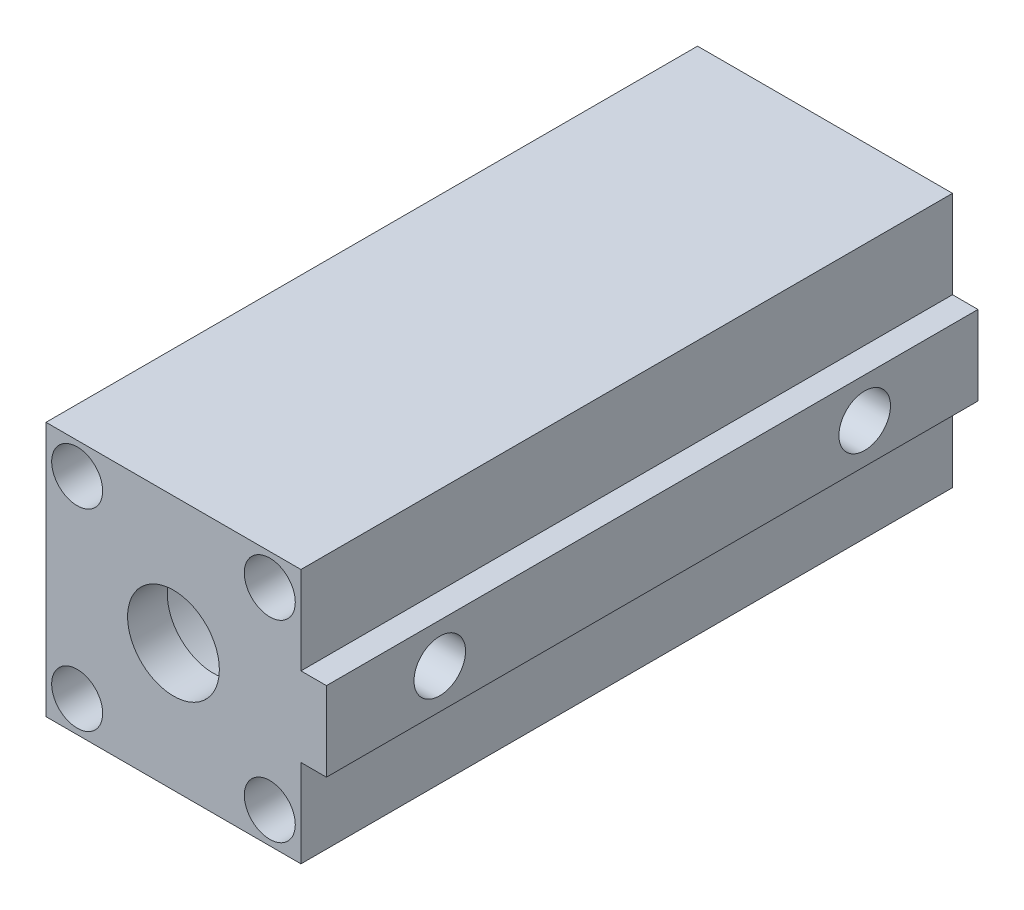
ISO-10303-21;
HEADER;
FILE_DESCRIPTION(('STEP AP214'),'2;1');
FILE_NAME('part.step','',(''),(''),'','','');
FILE_SCHEMA(('AUTOMOTIVE_DESIGN { 1 0 10303 214 1 1 1 1 }'));
ENDSEC;
DATA;
#1=APPLICATION_CONTEXT('core data for automotive mechanical design processes');
#2=APPLICATION_PROTOCOL_DEFINITION('international standard','automotive_design',2000,#1);
#3=PRODUCT_CONTEXT('',#1,'mechanical');
#4=PRODUCT('Part','Part','',(#3));
#5=PRODUCT_RELATED_PRODUCT_CATEGORY('part','',(#4));
#6=PRODUCT_DEFINITION_FORMATION('','',#4);
#7=PRODUCT_DEFINITION_CONTEXT('part definition',#1,'design');
#8=PRODUCT_DEFINITION('design','',#6,#7);
#9=PRODUCT_DEFINITION_SHAPE('','',#8);
#10=(LENGTH_UNIT() NAMED_UNIT(*) SI_UNIT(.MILLI.,.METRE.));
#11=(NAMED_UNIT(*) PLANE_ANGLE_UNIT() SI_UNIT($,.RADIAN.));
#12=(NAMED_UNIT(*) SI_UNIT($,.STERADIAN.) SOLID_ANGLE_UNIT());
#13=UNCERTAINTY_MEASURE_WITH_UNIT(LENGTH_MEASURE(1.E-05),#10,'distance_accuracy_value','');
#14=(GEOMETRIC_REPRESENTATION_CONTEXT(3) GLOBAL_UNCERTAINTY_ASSIGNED_CONTEXT((#13)) GLOBAL_UNIT_ASSIGNED_CONTEXT((#10,
#11,#12)) REPRESENTATION_CONTEXT('',''));
#15=CARTESIAN_POINT('',(0.,0.,0.));
#16=DIRECTION('',(0.,0.,1.));
#17=DIRECTION('',(1.,0.,0.));
#18=AXIS2_PLACEMENT_3D('',#15,#16,#17);
#19=CARTESIAN_POINT('',(22.5,-22.5,115.));
#20=DIRECTION('',(-1.,0.,0.));
#21=DIRECTION('',(0.,0.,1.));
#22=AXIS2_PLACEMENT_3D('',#19,#20,#21);
#23=PLANE('',#22);
#24=DIRECTION('',(0.,0.,-1.));
#25=VECTOR('',#24,1.);
#26=CARTESIAN_POINT('',(22.5,-7.,115.));
#27=LINE('',#26,#25);
#28=CARTESIAN_POINT('',(22.5,-7.,115.));
#29=VERTEX_POINT('',#28);
#30=CARTESIAN_POINT('',(22.5,-7.,0.));
#31=VERTEX_POINT('',#30);
#32=EDGE_CURVE('E11',#29,#31,#27,.T.);
#33=ORIENTED_EDGE('',*,*,#32,.F.);
#34=DIRECTION('',(0.,1.,0.));
#35=VECTOR('',#34,1.);
#36=CARTESIAN_POINT('',(22.5,-22.5,115.));
#37=LINE('',#36,#35);
#38=CARTESIAN_POINT('',(22.5,-22.5,115.));
#39=VERTEX_POINT('',#38);
#40=EDGE_CURVE('E124',#39,#29,#37,.T.);
#41=ORIENTED_EDGE('',*,*,#40,.F.);
#42=DIRECTION('',(0.,0.,-1.));
#43=VECTOR('',#42,1.);
#44=CARTESIAN_POINT('',(22.5,-22.5,115.));
#45=LINE('',#44,#43);
#46=CARTESIAN_POINT('',(22.5,-22.5,0.));
#47=VERTEX_POINT('',#46);
#48=EDGE_CURVE('E220',#39,#47,#45,.T.);
#49=ORIENTED_EDGE('',*,*,#48,.T.);
#50=DIRECTION('',(0.,1.,0.));
#51=VECTOR('',#50,1.);
#52=CARTESIAN_POINT('',(22.5,-22.5,0.));
#53=LINE('',#52,#51);
#54=EDGE_CURVE('E206',#47,#31,#53,.T.);
#55=ORIENTED_EDGE('',*,*,#54,.T.);
#56=EDGE_LOOP('',(#33,#41,#49,#55));
#57=FACE_BOUND('',#56,.T.);
#58=ADVANCED_FACE('F39',(#57),#23,.F.);
#59=DIRECTION('',(0.,0.,1.));
#60=VECTOR('',#59,1.);
#61=CARTESIAN_POINT('',(22.5,7.,115.));
#62=LINE('',#61,#60);
#63=CARTESIAN_POINT('',(22.5,6.99999999999999,0.));
#64=VERTEX_POINT('',#63);
#65=CARTESIAN_POINT('',(22.5,7.,115.));
#66=VERTEX_POINT('',#65);
#67=EDGE_CURVE('E50',#64,#66,#62,.T.);
#68=ORIENTED_EDGE('',*,*,#67,.F.);
#69=CARTESIAN_POINT('',(22.5,22.5,0.));
#70=VERTEX_POINT('',#69);
#71=EDGE_CURVE('E209',#64,#70,#53,.T.);
#72=ORIENTED_EDGE('',*,*,#71,.T.);
#73=DIRECTION('',(0.,0.,-1.));
#74=VECTOR('',#73,1.);
#75=CARTESIAN_POINT('',(22.5,22.5,115.));
#76=LINE('',#75,#74);
#77=CARTESIAN_POINT('',(22.5,22.5,115.));
#78=VERTEX_POINT('',#77);
#79=EDGE_CURVE('E211',#78,#70,#76,.T.);
#80=ORIENTED_EDGE('',*,*,#79,.F.);
#81=EDGE_CURVE('E197',#66,#78,#37,.T.);
#82=ORIENTED_EDGE('',*,*,#81,.F.);
#83=EDGE_LOOP('',(#68,#72,#80,#82));
#84=FACE_BOUND('',#83,.T.);
#85=ADVANCED_FACE('F295',(#84),#23,.F.);
#86=CARTESIAN_POINT('',(-17.,-17.,115.));
#87=DIRECTION('',(0.,0.,-1.));
#88=DIRECTION('',(-1.,0.,0.));
#89=AXIS2_PLACEMENT_3D('',#86,#87,#88);
#90=CYLINDRICAL_SURFACE('',#89,2.75);
#91=CARTESIAN_POINT('',(-17.,-17.,7.00000000000001));
#92=DIRECTION('',(0.,0.,1.));
#93=DIRECTION('',(1.,0.,0.));
#94=AXIS2_PLACEMENT_3D('',#91,#92,#93);
#95=CIRCLE('',#94,2.75);
#96=CARTESIAN_POINT('',(-14.25,-17.,7.00000000000001));
#97=VERTEX_POINT('',#96);
#98=EDGE_CURVE('E189',#97,#97,#95,.T.);
#99=ORIENTED_EDGE('',*,*,#98,.F.);
#100=EDGE_LOOP('',(#99));
#101=FACE_BOUND('',#100,.T.);
#102=CARTESIAN_POINT('',(-17.,-17.,108.));
#103=DIRECTION('',(0.,0.,1.));
#104=DIRECTION('',(1.,0.,0.));
#105=AXIS2_PLACEMENT_3D('',#102,#103,#104);
#106=CIRCLE('',#105,2.75);
#107=CARTESIAN_POINT('',(-14.25,-17.,108.));
#108=VERTEX_POINT('',#107);
#109=EDGE_CURVE('E164',#108,#108,#106,.T.);
#110=ORIENTED_EDGE('',*,*,#109,.T.);
#111=EDGE_LOOP('',(#110));
#112=FACE_BOUND('',#111,.T.);
#113=ADVANCED_FACE('F299',(#101,#112),#90,.F.);
#114=CARTESIAN_POINT('',(-17.,17.,115.));
#115=DIRECTION('',(0.,0.,-1.));
#116=DIRECTION('',(-1.,0.,0.));
#117=AXIS2_PLACEMENT_3D('',#114,#115,#116);
#118=CYLINDRICAL_SURFACE('',#117,2.75);
#119=CARTESIAN_POINT('',(-17.,17.,7.00000000000001));
#120=DIRECTION('',(0.,0.,1.));
#121=DIRECTION('',(1.,0.,0.));
#122=AXIS2_PLACEMENT_3D('',#119,#120,#121);
#123=CIRCLE('',#122,2.75);
#124=CARTESIAN_POINT('',(-14.25,17.,7.00000000000001));
#125=VERTEX_POINT('',#124);
#126=EDGE_CURVE('E232',#125,#125,#123,.T.);
#127=ORIENTED_EDGE('',*,*,#126,.F.);
#128=EDGE_LOOP('',(#127));
#129=FACE_BOUND('',#128,.T.);
#130=CARTESIAN_POINT('',(-17.,17.,108.));
#131=DIRECTION('',(0.,0.,1.));
#132=DIRECTION('',(1.,0.,0.));
#133=AXIS2_PLACEMENT_3D('',#130,#131,#132);
#134=CIRCLE('',#133,2.75);
#135=CARTESIAN_POINT('',(-14.25,17.,108.));
#136=VERTEX_POINT('',#135);
#137=EDGE_CURVE('E242',#136,#136,#134,.T.);
#138=ORIENTED_EDGE('',*,*,#137,.T.);
#139=EDGE_LOOP('',(#138));
#140=FACE_BOUND('',#139,.T.);
#141=ADVANCED_FACE('F335',(#129,#140),#118,.F.);
#142=CARTESIAN_POINT('',(17.,-17.,115.));
#143=DIRECTION('',(0.,0.,-1.));
#144=DIRECTION('',(-1.,0.,0.));
#145=AXIS2_PLACEMENT_3D('',#142,#143,#144);
#146=CYLINDRICAL_SURFACE('',#145,2.75);
#147=CARTESIAN_POINT('',(17.,-17.,7.00000000000001));
#148=DIRECTION('',(0.,0.,1.));
#149=DIRECTION('',(1.,0.,0.));
#150=AXIS2_PLACEMENT_3D('',#147,#148,#149);
#151=CIRCLE('',#150,2.75);
#152=CARTESIAN_POINT('',(19.75,-17.,7.00000000000001));
#153=VERTEX_POINT('',#152);
#154=EDGE_CURVE('E230',#153,#153,#151,.T.);
#155=ORIENTED_EDGE('',*,*,#154,.F.);
#156=EDGE_LOOP('',(#155));
#157=FACE_BOUND('',#156,.T.);
#158=CARTESIAN_POINT('',(17.,-17.,108.));
#159=DIRECTION('',(0.,0.,1.));
#160=DIRECTION('',(1.,0.,0.));
#161=AXIS2_PLACEMENT_3D('',#158,#159,#160);
#162=CIRCLE('',#161,2.75);
#163=CARTESIAN_POINT('',(19.75,-17.,108.));
#164=VERTEX_POINT('',#163);
#165=EDGE_CURVE('E239',#164,#164,#162,.T.);
#166=ORIENTED_EDGE('',*,*,#165,.T.);
#167=EDGE_LOOP('',(#166));
#168=FACE_BOUND('',#167,.T.);
#169=ADVANCED_FACE('F336',(#157,#168),#146,.F.);
#170=CARTESIAN_POINT('',(17.,17.,115.));
#171=DIRECTION('',(0.,0.,-1.));
#172=DIRECTION('',(-1.,0.,0.));
#173=AXIS2_PLACEMENT_3D('',#170,#171,#172);
#174=CYLINDRICAL_SURFACE('',#173,2.75);
#175=CARTESIAN_POINT('',(17.,17.,7.00000000000001));
#176=DIRECTION('',(0.,0.,1.));
#177=DIRECTION('',(1.,0.,0.));
#178=AXIS2_PLACEMENT_3D('',#175,#176,#177);
#179=CIRCLE('',#178,2.75);
#180=CARTESIAN_POINT('',(19.75,17.,7.00000000000001));
#181=VERTEX_POINT('',#180);
#182=EDGE_CURVE('E178',#181,#181,#179,.T.);
#183=ORIENTED_EDGE('',*,*,#182,.F.);
#184=EDGE_LOOP('',(#183));
#185=FACE_BOUND('',#184,.T.);
#186=CARTESIAN_POINT('',(17.,17.,108.));
#187=DIRECTION('',(0.,0.,1.));
#188=DIRECTION('',(1.,0.,0.));
#189=AXIS2_PLACEMENT_3D('',#186,#187,#188);
#190=CIRCLE('',#189,2.75);
#191=CARTESIAN_POINT('',(19.75,17.,108.));
#192=VERTEX_POINT('',#191);
#193=EDGE_CURVE('E155',#192,#192,#190,.T.);
#194=ORIENTED_EDGE('',*,*,#193,.T.);
#195=EDGE_LOOP('',(#194));
#196=FACE_BOUND('',#195,.T.);
#197=ADVANCED_FACE('F330',(#185,#196),#174,.F.);
#198=CARTESIAN_POINT('',(0.,0.,115.));
#199=DIRECTION('',(0.,0.,1.));
#200=DIRECTION('',(1.,0.,0.));
#201=AXIS2_PLACEMENT_3D('',#198,#199,#200);
#202=PLANE('',#201);
#203=ORIENTED_EDGE('',*,*,#40,.T.);
#204=DIRECTION('',(-1.,0.,0.));
#205=VECTOR('',#204,1.);
#206=CARTESIAN_POINT('',(27.,-7.,115.));
#207=LINE('',#206,#205);
#208=CARTESIAN_POINT('',(27.,-7.,115.));
#209=VERTEX_POINT('',#208);
#210=EDGE_CURVE('E108',#209,#29,#207,.T.);
#211=ORIENTED_EDGE('',*,*,#210,.F.);
#212=DIRECTION('',(0.,-1.,0.));
#213=VECTOR('',#212,1.);
#214=CARTESIAN_POINT('',(27.,7.,115.));
#215=LINE('',#214,#213);
#216=CARTESIAN_POINT('',(27.,7.,115.));
#217=VERTEX_POINT('',#216);
#218=EDGE_CURVE('E115',#217,#209,#215,.T.);
#219=ORIENTED_EDGE('',*,*,#218,.F.);
#220=DIRECTION('',(-1.,0.,0.));
#221=VECTOR('',#220,1.);
#222=CARTESIAN_POINT('',(27.,7.,115.));
#223=LINE('',#222,#221);
#224=EDGE_CURVE('E249',#217,#66,#223,.T.);
#225=ORIENTED_EDGE('',*,*,#224,.T.);
#226=ORIENTED_EDGE('',*,*,#81,.T.);
#227=DIRECTION('',(-1.,0.,0.));
#228=VECTOR('',#227,1.);
#229=CARTESIAN_POINT('',(22.5,22.5,115.));
#230=LINE('',#229,#228);
#231=CARTESIAN_POINT('',(-22.5,22.5,115.));
#232=VERTEX_POINT('',#231);
#233=EDGE_CURVE('E201',#78,#232,#230,.T.);
#234=ORIENTED_EDGE('',*,*,#233,.T.);
#235=DIRECTION('',(0.,-1.,0.));
#236=VECTOR('',#235,1.);
#237=CARTESIAN_POINT('',(-22.5,22.5,115.));
#238=LINE('',#237,#236);
#239=CARTESIAN_POINT('',(-22.5,-22.5,115.));
#240=VERTEX_POINT('',#239);
#241=EDGE_CURVE('E193',#232,#240,#238,.T.);
#242=ORIENTED_EDGE('',*,*,#241,.T.);
#243=DIRECTION('',(1.,0.,0.));
#244=VECTOR('',#243,1.);
#245=CARTESIAN_POINT('',(-22.5,-22.5,115.));
#246=LINE('',#245,#244);
#247=EDGE_CURVE('E196',#240,#39,#246,.T.);
#248=ORIENTED_EDGE('',*,*,#247,.T.);
#249=EDGE_LOOP('',(#203,#211,#219,#225,#226,#234,#242,#248));
#250=FACE_BOUND('',#249,.T.);
#251=CARTESIAN_POINT('',(-17.,17.,115.));
#252=DIRECTION('',(0.,0.,1.));
#253=DIRECTION('',(1.,0.,0.));
#254=AXIS2_PLACEMENT_3D('',#251,#252,#253);
#255=CIRCLE('',#254,4.5);
#256=CARTESIAN_POINT('',(-12.5,17.,115.));
#257=VERTEX_POINT('',#256);
#258=EDGE_CURVE('E145',#257,#257,#255,.T.);
#259=ORIENTED_EDGE('',*,*,#258,.F.);
#260=EDGE_LOOP('',(#259));
#261=FACE_BOUND('',#260,.T.);
#262=CARTESIAN_POINT('',(17.,-17.,115.));
#263=DIRECTION('',(0.,0.,1.));
#264=DIRECTION('',(1.,0.,0.));
#265=AXIS2_PLACEMENT_3D('',#262,#263,#264);
#266=CIRCLE('',#265,4.5);
#267=CARTESIAN_POINT('',(21.5,-17.,115.));
#268=VERTEX_POINT('',#267);
#269=EDGE_CURVE('E137',#268,#268,#266,.T.);
#270=ORIENTED_EDGE('',*,*,#269,.F.);
#271=EDGE_LOOP('',(#270));
#272=FACE_BOUND('',#271,.T.);
#273=CARTESIAN_POINT('',(17.,17.,115.));
#274=DIRECTION('',(0.,0.,1.));
#275=DIRECTION('',(1.,0.,0.));
#276=AXIS2_PLACEMENT_3D('',#273,#274,#275);
#277=CIRCLE('',#276,4.5);
#278=CARTESIAN_POINT('',(21.5,17.,115.));
#279=VERTEX_POINT('',#278);
#280=EDGE_CURVE('E126',#279,#279,#277,.T.);
#281=ORIENTED_EDGE('',*,*,#280,.F.);
#282=EDGE_LOOP('',(#281));
#283=FACE_BOUND('',#282,.T.);
#284=CARTESIAN_POINT('',(-17.,-17.,115.));
#285=DIRECTION('',(0.,0.,1.));
#286=DIRECTION('',(1.,0.,0.));
#287=AXIS2_PLACEMENT_3D('',#284,#285,#286);
#288=CIRCLE('',#287,4.5);
#289=CARTESIAN_POINT('',(-12.5,-17.,115.));
#290=VERTEX_POINT('',#289);
#291=EDGE_CURVE('E148',#290,#290,#288,.T.);
#292=ORIENTED_EDGE('',*,*,#291,.F.);
#293=EDGE_LOOP('',(#292));
#294=FACE_BOUND('',#293,.T.);
#295=CARTESIAN_POINT('',(0.,0.,115.));
#296=DIRECTION('',(0.,0.,1.));
#297=DIRECTION('',(1.,0.,0.));
#298=AXIS2_PLACEMENT_3D('',#295,#296,#297);
#299=CIRCLE('',#298,8.1);
#300=CARTESIAN_POINT('',(8.1,0.,115.));
#301=VERTEX_POINT('',#300);
#302=EDGE_CURVE('E182',#301,#301,#299,.T.);
#303=ORIENTED_EDGE('',*,*,#302,.F.);
#304=EDGE_LOOP('',(#303));
#305=FACE_BOUND('',#304,.T.);
#306=ADVANCED_FACE('F123',(#250,#261,#272,#283,#294,#305),#202,.T.);
#307=CARTESIAN_POINT('',(0.,0.,0.));
#308=DIRECTION('',(0.,0.,1.));
#309=DIRECTION('',(1.,0.,0.));
#310=AXIS2_PLACEMENT_3D('',#307,#308,#309);
#311=PLANE('',#310);
#312=CARTESIAN_POINT('',(-17.,17.,0.));
#313=DIRECTION('',(0.,0.,1.));
#314=DIRECTION('',(1.,0.,0.));
#315=AXIS2_PLACEMENT_3D('',#312,#313,#314);
#316=CIRCLE('',#315,4.5);
#317=CARTESIAN_POINT('',(-12.5,17.,0.));
#318=VERTEX_POINT('',#317);
#319=EDGE_CURVE('E161',#318,#318,#316,.T.);
#320=ORIENTED_EDGE('',*,*,#319,.T.);
#321=EDGE_LOOP('',(#320));
#322=FACE_BOUND('',#321,.T.);
#323=CARTESIAN_POINT('',(17.,-17.,0.));
#324=DIRECTION('',(0.,0.,1.));
#325=DIRECTION('',(1.,0.,0.));
#326=AXIS2_PLACEMENT_3D('',#323,#324,#325);
#327=CIRCLE('',#326,4.5);
#328=CARTESIAN_POINT('',(21.5,-17.,0.));
#329=VERTEX_POINT('',#328);
#330=EDGE_CURVE('E172',#329,#329,#327,.T.);
#331=ORIENTED_EDGE('',*,*,#330,.T.);
#332=EDGE_LOOP('',(#331));
#333=FACE_BOUND('',#332,.T.);
#334=CARTESIAN_POINT('',(17.,17.,0.));
#335=DIRECTION('',(0.,0.,1.));
#336=DIRECTION('',(1.,0.,0.));
#337=AXIS2_PLACEMENT_3D('',#334,#335,#336);
#338=CIRCLE('',#337,4.5);
#339=CARTESIAN_POINT('',(21.5,17.,0.));
#340=VERTEX_POINT('',#339);
#341=EDGE_CURVE('E157',#340,#340,#338,.T.);
#342=ORIENTED_EDGE('',*,*,#341,.T.);
#343=EDGE_LOOP('',(#342));
#344=FACE_BOUND('',#343,.T.);
#345=CARTESIAN_POINT('',(-17.,-17.,0.));
#346=DIRECTION('',(0.,0.,1.));
#347=DIRECTION('',(1.,0.,0.));
#348=AXIS2_PLACEMENT_3D('',#345,#346,#347);
#349=CIRCLE('',#348,4.5);
#350=CARTESIAN_POINT('',(-12.5,-17.,0.));
#351=VERTEX_POINT('',#350);
#352=EDGE_CURVE('E170',#351,#351,#349,.T.);
#353=ORIENTED_EDGE('',*,*,#352,.T.);
#354=EDGE_LOOP('',(#353));
#355=FACE_BOUND('',#354,.T.);
#356=ORIENTED_EDGE('',*,*,#71,.F.);
#357=DIRECTION('',(-1.,0.,0.));
#358=VECTOR('',#357,1.);
#359=CARTESIAN_POINT('',(27.,7.,0.));
#360=LINE('',#359,#358);
#361=CARTESIAN_POINT('',(27.,7.,0.));
#362=VERTEX_POINT('',#361);
#363=EDGE_CURVE('E132',#362,#64,#360,.T.);
#364=ORIENTED_EDGE('',*,*,#363,.F.);
#365=DIRECTION('',(0.,1.,0.));
#366=VECTOR('',#365,1.);
#367=CARTESIAN_POINT('',(27.,-7.,0.));
#368=LINE('',#367,#366);
#369=CARTESIAN_POINT('',(27.,-7.,0.));
#370=VERTEX_POINT('',#369);
#371=EDGE_CURVE('E113',#370,#362,#368,.T.);
#372=ORIENTED_EDGE('',*,*,#371,.F.);
#373=DIRECTION('',(-1.,0.,0.));
#374=VECTOR('',#373,1.);
#375=CARTESIAN_POINT('',(27.,-7.,0.));
#376=LINE('',#375,#374);
#377=EDGE_CURVE('E106',#370,#31,#376,.T.);
#378=ORIENTED_EDGE('',*,*,#377,.T.);
#379=ORIENTED_EDGE('',*,*,#54,.F.);
#380=DIRECTION('',(1.,0.,0.));
#381=VECTOR('',#380,1.);
#382=CARTESIAN_POINT('',(-22.5,-22.5,0.));
#383=LINE('',#382,#381);
#384=CARTESIAN_POINT('',(-22.5,-22.5,0.));
#385=VERTEX_POINT('',#384);
#386=EDGE_CURVE('E207',#385,#47,#383,.T.);
#387=ORIENTED_EDGE('',*,*,#386,.F.);
#388=DIRECTION('',(0.,-1.,0.));
#389=VECTOR('',#388,1.);
#390=CARTESIAN_POINT('',(-22.5,22.5,0.));
#391=LINE('',#390,#389);
#392=CARTESIAN_POINT('',(-22.5,22.5,0.));
#393=VERTEX_POINT('',#392);
#394=EDGE_CURVE('E195',#393,#385,#391,.T.);
#395=ORIENTED_EDGE('',*,*,#394,.F.);
#396=DIRECTION('',(-1.,0.,0.));
#397=VECTOR('',#396,1.);
#398=CARTESIAN_POINT('',(22.5,22.5,0.));
#399=LINE('',#398,#397);
#400=EDGE_CURVE('E200',#70,#393,#399,.T.);
#401=ORIENTED_EDGE('',*,*,#400,.F.);
#402=EDGE_LOOP('',(#356,#364,#372,#378,#379,#387,#395,#401));
#403=FACE_BOUND('',#402,.T.);
#404=ADVANCED_FACE('F312',(#322,#333,#344,#355,#403),#311,.F.);
#405=CARTESIAN_POINT('',(-22.5,22.5,115.));
#406=DIRECTION('',(1.,0.,0.));
#407=DIRECTION('',(0.,0.,-1.));
#408=AXIS2_PLACEMENT_3D('',#405,#406,#407);
#409=PLANE('',#408);
#410=ORIENTED_EDGE('',*,*,#394,.T.);
#411=DIRECTION('',(0.,0.,-1.));
#412=VECTOR('',#411,1.);
#413=CARTESIAN_POINT('',(-22.5,-22.5,115.));
#414=LINE('',#413,#412);
#415=EDGE_CURVE('E216',#240,#385,#414,.T.);
#416=ORIENTED_EDGE('',*,*,#415,.F.);
#417=ORIENTED_EDGE('',*,*,#241,.F.);
#418=DIRECTION('',(0.,0.,-1.));
#419=VECTOR('',#418,1.);
#420=CARTESIAN_POINT('',(-22.5,22.5,115.));
#421=LINE('',#420,#419);
#422=EDGE_CURVE('E202',#232,#393,#421,.T.);
#423=ORIENTED_EDGE('',*,*,#422,.T.);
#424=EDGE_LOOP('',(#410,#416,#417,#423));
#425=FACE_BOUND('',#424,.T.);
#426=ADVANCED_FACE('F41',(#425),#409,.F.);
#427=CARTESIAN_POINT('',(-22.5,-22.5,115.));
#428=DIRECTION('',(0.,1.,0.));
#429=DIRECTION('',(0.,0.,1.));
#430=AXIS2_PLACEMENT_3D('',#427,#428,#429);
#431=PLANE('',#430);
#432=ORIENTED_EDGE('',*,*,#386,.T.);
#433=ORIENTED_EDGE('',*,*,#48,.F.);
#434=ORIENTED_EDGE('',*,*,#247,.F.);
#435=ORIENTED_EDGE('',*,*,#415,.T.);
#436=EDGE_LOOP('',(#432,#433,#434,#435));
#437=FACE_BOUND('',#436,.T.);
#438=ADVANCED_FACE('F301',(#437),#431,.F.);
#439=CARTESIAN_POINT('',(22.5,22.5,115.));
#440=DIRECTION('',(0.,-1.,0.));
#441=DIRECTION('',(0.,0.,-1.));
#442=AXIS2_PLACEMENT_3D('',#439,#440,#441);
#443=PLANE('',#442);
#444=ORIENTED_EDGE('',*,*,#400,.T.);
#445=ORIENTED_EDGE('',*,*,#422,.F.);
#446=ORIENTED_EDGE('',*,*,#233,.F.);
#447=ORIENTED_EDGE('',*,*,#79,.T.);
#448=EDGE_LOOP('',(#444,#445,#446,#447));
#449=FACE_BOUND('',#448,.T.);
#450=ADVANCED_FACE('F298',(#449),#443,.F.);
#451=CARTESIAN_POINT('',(0.,0.,108.));
#452=DIRECTION('',(0.,0.,1.));
#453=DIRECTION('',(1.,0.,0.));
#454=AXIS2_PLACEMENT_3D('',#451,#452,#453);
#455=PLANE('',#454);
#456=CARTESIAN_POINT('',(0.,0.,108.));
#457=DIRECTION('',(0.,0.,1.));
#458=DIRECTION('',(1.,0.,0.));
#459=AXIS2_PLACEMENT_3D('',#456,#457,#458);
#460=CIRCLE('',#459,16.);
#461=CARTESIAN_POINT('',(16.,0.,108.));
#462=VERTEX_POINT('',#461);
#463=EDGE_CURVE('E184',#462,#462,#460,.T.);
#464=ORIENTED_EDGE('',*,*,#463,.F.);
#465=EDGE_LOOP('',(#464));
#466=FACE_BOUND('',#465,.T.);
#467=CARTESIAN_POINT('',(0.,0.,108.));
#468=DIRECTION('',(0.,0.,1.));
#469=DIRECTION('',(1.,0.,0.));
#470=AXIS2_PLACEMENT_3D('',#467,#468,#469);
#471=CIRCLE('',#470,8.1);
#472=CARTESIAN_POINT('',(8.1,0.,108.));
#473=VERTEX_POINT('',#472);
#474=EDGE_CURVE('E188',#473,#473,#471,.T.);
#475=ORIENTED_EDGE('',*,*,#474,.T.);
#476=EDGE_LOOP('',(#475));
#477=FACE_BOUND('',#476,.T.);
#478=ADVANCED_FACE('F309',(#466,#477),#455,.F.);
#479=CARTESIAN_POINT('',(0.,0.,115.));
#480=DIRECTION('',(0.,0.,-1.));
#481=DIRECTION('',(-1.,0.,0.));
#482=AXIS2_PLACEMENT_3D('',#479,#480,#481);
#483=CYLINDRICAL_SURFACE('',#482,8.1);
#484=ORIENTED_EDGE('',*,*,#302,.T.);
#485=EDGE_LOOP('',(#484));
#486=FACE_BOUND('',#485,.T.);
#487=ORIENTED_EDGE('',*,*,#474,.F.);
#488=EDGE_LOOP('',(#487));
#489=FACE_BOUND('',#488,.T.);
#490=ADVANCED_FACE('F353',(#486,#489),#483,.F.);
#491=CARTESIAN_POINT('',(0.,0.,7.));
#492=DIRECTION('',(0.,0.,1.));
#493=DIRECTION('',(1.,0.,0.));
#494=AXIS2_PLACEMENT_3D('',#491,#492,#493);
#495=PLANE('',#494);
#496=CARTESIAN_POINT('',(0.,0.,7.00000000000001));
#497=DIRECTION('',(0.,0.,1.));
#498=DIRECTION('',(1.,0.,0.));
#499=AXIS2_PLACEMENT_3D('',#496,#497,#498);
#500=CIRCLE('',#499,16.);
#501=CARTESIAN_POINT('',(16.,0.,7.00000000000001));
#502=VERTEX_POINT('',#501);
#503=EDGE_CURVE('E224',#502,#502,#500,.T.);
#504=ORIENTED_EDGE('',*,*,#503,.T.);
#505=EDGE_LOOP('',(#504));
#506=FACE_BOUND('',#505,.T.);
#507=ADVANCED_FACE('F349',(#506),#495,.T.);
#508=CARTESIAN_POINT('',(0.,0.,115.));
#509=DIRECTION('',(0.,0.,-1.));
#510=DIRECTION('',(-1.,0.,0.));
#511=AXIS2_PLACEMENT_3D('',#508,#509,#510);
#512=CYLINDRICAL_SURFACE('',#511,16.);
#513=ORIENTED_EDGE('',*,*,#503,.F.);
#514=EDGE_LOOP('',(#513));
#515=FACE_BOUND('',#514,.T.);
#516=ORIENTED_EDGE('',*,*,#463,.T.);
#517=EDGE_LOOP('',(#516));
#518=FACE_BOUND('',#517,.T.);
#519=ADVANCED_FACE('F346',(#515,#518),#512,.F.);
#520=CARTESIAN_POINT('',(17.,17.,7.));
#521=DIRECTION('',(0.,0.,-1.));
#522=DIRECTION('',(-1.,0.,0.));
#523=AXIS2_PLACEMENT_3D('',#520,#521,#522);
#524=CYLINDRICAL_SURFACE('',#523,4.5);
#525=CARTESIAN_POINT('',(17.,17.,7.));
#526=DIRECTION('',(0.,0.,1.));
#527=DIRECTION('',(1.,0.,0.));
#528=AXIS2_PLACEMENT_3D('',#525,#526,#527);
#529=CIRCLE('',#528,4.5);
#530=CARTESIAN_POINT('',(21.5,17.,7.));
#531=VERTEX_POINT('',#530);
#532=EDGE_CURVE('E158',#531,#531,#529,.T.);
#533=ORIENTED_EDGE('',*,*,#532,.T.);
#534=EDGE_LOOP('',(#533));
#535=FACE_BOUND('',#534,.T.);
#536=ORIENTED_EDGE('',*,*,#341,.F.);
#537=EDGE_LOOP('',(#536));
#538=FACE_BOUND('',#537,.T.);
#539=ADVANCED_FACE('F347',(#535,#538),#524,.F.);
#540=CARTESIAN_POINT('',(17.,17.,7.));
#541=DIRECTION('',(0.,0.,1.));
#542=DIRECTION('',(1.,0.,0.));
#543=AXIS2_PLACEMENT_3D('',#540,#541,#542);
#544=PLANE('',#543);
#545=ORIENTED_EDGE('',*,*,#182,.T.);
#546=EDGE_LOOP('',(#545));
#547=FACE_BOUND('',#546,.T.);
#548=ORIENTED_EDGE('',*,*,#532,.F.);
#549=EDGE_LOOP('',(#548));
#550=FACE_BOUND('',#549,.T.);
#551=ADVANCED_FACE('F377',(#547,#550),#544,.F.);
#552=CARTESIAN_POINT('',(17.,-17.,7.));
#553=DIRECTION('',(0.,0.,-1.));
#554=DIRECTION('',(-1.,0.,0.));
#555=AXIS2_PLACEMENT_3D('',#552,#553,#554);
#556=CYLINDRICAL_SURFACE('',#555,4.5);
#557=CARTESIAN_POINT('',(17.,-17.,7.));
#558=DIRECTION('',(0.,0.,1.));
#559=DIRECTION('',(1.,0.,0.));
#560=AXIS2_PLACEMENT_3D('',#557,#558,#559);
#561=CIRCLE('',#560,4.5);
#562=CARTESIAN_POINT('',(21.5,-17.,7.));
#563=VERTEX_POINT('',#562);
#564=EDGE_CURVE('E159',#563,#563,#561,.T.);
#565=ORIENTED_EDGE('',*,*,#564,.T.);
#566=EDGE_LOOP('',(#565));
#567=FACE_BOUND('',#566,.T.);
#568=ORIENTED_EDGE('',*,*,#330,.F.);
#569=EDGE_LOOP('',(#568));
#570=FACE_BOUND('',#569,.T.);
#571=ADVANCED_FACE('F379',(#567,#570),#556,.F.);
#572=CARTESIAN_POINT('',(17.,-17.,7.));
#573=DIRECTION('',(0.,0.,1.));
#574=DIRECTION('',(1.,0.,0.));
#575=AXIS2_PLACEMENT_3D('',#572,#573,#574);
#576=PLANE('',#575);
#577=ORIENTED_EDGE('',*,*,#154,.T.);
#578=EDGE_LOOP('',(#577));
#579=FACE_BOUND('',#578,.T.);
#580=ORIENTED_EDGE('',*,*,#564,.F.);
#581=EDGE_LOOP('',(#580));
#582=FACE_BOUND('',#581,.T.);
#583=ADVANCED_FACE('F375',(#579,#582),#576,.F.);
#584=CARTESIAN_POINT('',(-17.,17.,7.));
#585=DIRECTION('',(0.,0.,-1.));
#586=DIRECTION('',(-1.,0.,0.));
#587=AXIS2_PLACEMENT_3D('',#584,#585,#586);
#588=CYLINDRICAL_SURFACE('',#587,4.5);
#589=CARTESIAN_POINT('',(-17.,17.,7.));
#590=DIRECTION('',(0.,0.,1.));
#591=DIRECTION('',(1.,0.,0.));
#592=AXIS2_PLACEMENT_3D('',#589,#590,#591);
#593=CIRCLE('',#592,4.5);
#594=CARTESIAN_POINT('',(-12.5,17.,7.));
#595=VERTEX_POINT('',#594);
#596=EDGE_CURVE('E168',#595,#595,#593,.T.);
#597=ORIENTED_EDGE('',*,*,#596,.T.);
#598=EDGE_LOOP('',(#597));
#599=FACE_BOUND('',#598,.T.);
#600=ORIENTED_EDGE('',*,*,#319,.F.);
#601=EDGE_LOOP('',(#600));
#602=FACE_BOUND('',#601,.T.);
#603=ADVANCED_FACE('F373',(#599,#602),#588,.F.);
#604=CARTESIAN_POINT('',(-17.,17.,7.));
#605=DIRECTION('',(0.,0.,1.));
#606=DIRECTION('',(1.,0.,0.));
#607=AXIS2_PLACEMENT_3D('',#604,#605,#606);
#608=PLANE('',#607);
#609=ORIENTED_EDGE('',*,*,#126,.T.);
#610=EDGE_LOOP('',(#609));
#611=FACE_BOUND('',#610,.T.);
#612=ORIENTED_EDGE('',*,*,#596,.F.);
#613=EDGE_LOOP('',(#612));
#614=FACE_BOUND('',#613,.T.);
#615=ADVANCED_FACE('F367',(#611,#614),#608,.F.);
#616=CARTESIAN_POINT('',(-17.,-17.,7.));
#617=DIRECTION('',(0.,0.,-1.));
#618=DIRECTION('',(-1.,0.,0.));
#619=AXIS2_PLACEMENT_3D('',#616,#617,#618);
#620=CYLINDRICAL_SURFACE('',#619,4.5);
#621=CARTESIAN_POINT('',(-17.,-17.,7.));
#622=DIRECTION('',(0.,0.,1.));
#623=DIRECTION('',(1.,0.,0.));
#624=AXIS2_PLACEMENT_3D('',#621,#622,#623);
#625=CIRCLE('',#624,4.5);
#626=CARTESIAN_POINT('',(-12.5,-17.,7.));
#627=VERTEX_POINT('',#626);
#628=EDGE_CURVE('E179',#627,#627,#625,.T.);
#629=ORIENTED_EDGE('',*,*,#628,.T.);
#630=EDGE_LOOP('',(#629));
#631=FACE_BOUND('',#630,.T.);
#632=ORIENTED_EDGE('',*,*,#352,.F.);
#633=EDGE_LOOP('',(#632));
#634=FACE_BOUND('',#633,.T.);
#635=ADVANCED_FACE('F365',(#631,#634),#620,.F.);
#636=CARTESIAN_POINT('',(-17.,-17.,7.));
#637=DIRECTION('',(0.,0.,1.));
#638=DIRECTION('',(1.,0.,0.));
#639=AXIS2_PLACEMENT_3D('',#636,#637,#638);
#640=PLANE('',#639);
#641=ORIENTED_EDGE('',*,*,#98,.T.);
#642=EDGE_LOOP('',(#641));
#643=FACE_BOUND('',#642,.T.);
#644=ORIENTED_EDGE('',*,*,#628,.F.);
#645=EDGE_LOOP('',(#644));
#646=FACE_BOUND('',#645,.T.);
#647=ADVANCED_FACE('F363',(#643,#646),#640,.F.);
#648=CARTESIAN_POINT('',(17.,17.,115.));
#649=DIRECTION('',(0.,0.,-1.));
#650=DIRECTION('',(-1.,0.,0.));
#651=AXIS2_PLACEMENT_3D('',#648,#649,#650);
#652=CYLINDRICAL_SURFACE('',#651,4.5);
#653=ORIENTED_EDGE('',*,*,#280,.T.);
#654=EDGE_LOOP('',(#653));
#655=FACE_BOUND('',#654,.T.);
#656=CARTESIAN_POINT('',(17.,17.,108.));
#657=DIRECTION('',(0.,0.,1.));
#658=DIRECTION('',(1.,0.,0.));
#659=AXIS2_PLACEMENT_3D('',#656,#657,#658);
#660=CIRCLE('',#659,4.5);
#661=CARTESIAN_POINT('',(21.5,17.,108.));
#662=VERTEX_POINT('',#661);
#663=EDGE_CURVE('E128',#662,#662,#660,.T.);
#664=ORIENTED_EDGE('',*,*,#663,.F.);
#665=EDGE_LOOP('',(#664));
#666=FACE_BOUND('',#665,.T.);
#667=ADVANCED_FACE('F366',(#655,#666),#652,.F.);
#668=CARTESIAN_POINT('',(17.,17.,108.));
#669=DIRECTION('',(0.,0.,1.));
#670=DIRECTION('',(1.,0.,0.));
#671=AXIS2_PLACEMENT_3D('',#668,#669,#670);
#672=PLANE('',#671);
#673=ORIENTED_EDGE('',*,*,#193,.F.);
#674=EDGE_LOOP('',(#673));
#675=FACE_BOUND('',#674,.T.);
#676=ORIENTED_EDGE('',*,*,#663,.T.);
#677=EDGE_LOOP('',(#676));
#678=FACE_BOUND('',#677,.T.);
#679=ADVANCED_FACE('F409',(#675,#678),#672,.T.);
#680=CARTESIAN_POINT('',(17.,-17.,115.));
#681=DIRECTION('',(0.,0.,-1.));
#682=DIRECTION('',(-1.,0.,0.));
#683=AXIS2_PLACEMENT_3D('',#680,#681,#682);
#684=CYLINDRICAL_SURFACE('',#683,4.5);
#685=ORIENTED_EDGE('',*,*,#269,.T.);
#686=EDGE_LOOP('',(#685));
#687=FACE_BOUND('',#686,.T.);
#688=CARTESIAN_POINT('',(17.,-17.,108.));
#689=DIRECTION('',(0.,0.,1.));
#690=DIRECTION('',(1.,0.,0.));
#691=AXIS2_PLACEMENT_3D('',#688,#689,#690);
#692=CIRCLE('',#691,4.5);
#693=CARTESIAN_POINT('',(21.5,-17.,108.));
#694=VERTEX_POINT('',#693);
#695=EDGE_CURVE('E141',#694,#694,#692,.T.);
#696=ORIENTED_EDGE('',*,*,#695,.F.);
#697=EDGE_LOOP('',(#696));
#698=FACE_BOUND('',#697,.T.);
#699=ADVANCED_FACE('F408',(#687,#698),#684,.F.);
#700=CARTESIAN_POINT('',(17.,-17.,108.));
#701=DIRECTION('',(0.,0.,1.));
#702=DIRECTION('',(1.,0.,0.));
#703=AXIS2_PLACEMENT_3D('',#700,#701,#702);
#704=PLANE('',#703);
#705=ORIENTED_EDGE('',*,*,#165,.F.);
#706=EDGE_LOOP('',(#705));
#707=FACE_BOUND('',#706,.T.);
#708=ORIENTED_EDGE('',*,*,#695,.T.);
#709=EDGE_LOOP('',(#708));
#710=FACE_BOUND('',#709,.T.);
#711=ADVANCED_FACE('F401',(#707,#710),#704,.T.);
#712=CARTESIAN_POINT('',(-17.,17.,115.));
#713=DIRECTION('',(0.,0.,-1.));
#714=DIRECTION('',(-1.,0.,0.));
#715=AXIS2_PLACEMENT_3D('',#712,#713,#714);
#716=CYLINDRICAL_SURFACE('',#715,4.5);
#717=ORIENTED_EDGE('',*,*,#258,.T.);
#718=EDGE_LOOP('',(#717));
#719=FACE_BOUND('',#718,.T.);
#720=CARTESIAN_POINT('',(-17.,17.,108.));
#721=DIRECTION('',(0.,0.,1.));
#722=DIRECTION('',(1.,0.,0.));
#723=AXIS2_PLACEMENT_3D('',#720,#721,#722);
#724=CIRCLE('',#723,4.5);
#725=CARTESIAN_POINT('',(-12.5,17.,108.));
#726=VERTEX_POINT('',#725);
#727=EDGE_CURVE('E139',#726,#726,#724,.T.);
#728=ORIENTED_EDGE('',*,*,#727,.F.);
#729=EDGE_LOOP('',(#728));
#730=FACE_BOUND('',#729,.T.);
#731=ADVANCED_FACE('F402',(#719,#730),#716,.F.);
#732=CARTESIAN_POINT('',(-17.,17.,108.));
#733=DIRECTION('',(0.,0.,1.));
#734=DIRECTION('',(1.,0.,0.));
#735=AXIS2_PLACEMENT_3D('',#732,#733,#734);
#736=PLANE('',#735);
#737=ORIENTED_EDGE('',*,*,#137,.F.);
#738=EDGE_LOOP('',(#737));
#739=FACE_BOUND('',#738,.T.);
#740=ORIENTED_EDGE('',*,*,#727,.T.);
#741=EDGE_LOOP('',(#740));
#742=FACE_BOUND('',#741,.T.);
#743=ADVANCED_FACE('F399',(#739,#742),#736,.T.);
#744=CARTESIAN_POINT('',(-17.,-17.,115.));
#745=DIRECTION('',(0.,0.,-1.));
#746=DIRECTION('',(-1.,0.,0.));
#747=AXIS2_PLACEMENT_3D('',#744,#745,#746);
#748=CYLINDRICAL_SURFACE('',#747,4.5);
#749=ORIENTED_EDGE('',*,*,#291,.T.);
#750=EDGE_LOOP('',(#749));
#751=FACE_BOUND('',#750,.T.);
#752=CARTESIAN_POINT('',(-17.,-17.,108.));
#753=DIRECTION('',(0.,0.,1.));
#754=DIRECTION('',(1.,0.,0.));
#755=AXIS2_PLACEMENT_3D('',#752,#753,#754);
#756=CIRCLE('',#755,4.5);
#757=CARTESIAN_POINT('',(-12.5,-17.,108.));
#758=VERTEX_POINT('',#757);
#759=EDGE_CURVE('E142',#758,#758,#756,.T.);
#760=ORIENTED_EDGE('',*,*,#759,.F.);
#761=EDGE_LOOP('',(#760));
#762=FACE_BOUND('',#761,.T.);
#763=ADVANCED_FACE('F394',(#751,#762),#748,.F.);
#764=CARTESIAN_POINT('',(-17.,-17.,108.));
#765=DIRECTION('',(0.,0.,1.));
#766=DIRECTION('',(1.,0.,0.));
#767=AXIS2_PLACEMENT_3D('',#764,#765,#766);
#768=PLANE('',#767);
#769=ORIENTED_EDGE('',*,*,#109,.F.);
#770=EDGE_LOOP('',(#769));
#771=FACE_BOUND('',#770,.T.);
#772=ORIENTED_EDGE('',*,*,#759,.T.);
#773=EDGE_LOOP('',(#772));
#774=FACE_BOUND('',#773,.T.);
#775=ADVANCED_FACE('F400',(#771,#774),#768,.T.);
#776=CARTESIAN_POINT('',(27.,-7.,115.));
#777=DIRECTION('',(0.,1.,0.));
#778=DIRECTION('',(0.,0.,1.));
#779=AXIS2_PLACEMENT_3D('',#776,#777,#778);
#780=PLANE('',#779);
#781=ORIENTED_EDGE('',*,*,#210,.T.);
#782=ORIENTED_EDGE('',*,*,#32,.T.);
#783=ORIENTED_EDGE('',*,*,#377,.F.);
#784=DIRECTION('',(0.,0.,-1.));
#785=VECTOR('',#784,1.);
#786=CARTESIAN_POINT('',(27.,-7.,115.));
#787=LINE('',#786,#785);
#788=EDGE_CURVE('E101',#209,#370,#787,.T.);
#789=ORIENTED_EDGE('',*,*,#788,.F.);
#790=EDGE_LOOP('',(#781,#782,#783,#789));
#791=FACE_BOUND('',#790,.T.);
#792=ADVANCED_FACE('F103',(#791),#780,.F.);
#793=CARTESIAN_POINT('',(27.,7.,0.));
#794=DIRECTION('',(0.,-1.,0.));
#795=DIRECTION('',(0.,0.,-1.));
#796=AXIS2_PLACEMENT_3D('',#793,#794,#795);
#797=PLANE('',#796);
#798=ORIENTED_EDGE('',*,*,#363,.T.);
#799=ORIENTED_EDGE('',*,*,#67,.T.);
#800=ORIENTED_EDGE('',*,*,#224,.F.);
#801=DIRECTION('',(0.,0.,1.));
#802=VECTOR('',#801,1.);
#803=CARTESIAN_POINT('',(27.,7.,0.));
#804=LINE('',#803,#802);
#805=EDGE_CURVE('E120',#362,#217,#804,.T.);
#806=ORIENTED_EDGE('',*,*,#805,.F.);
#807=EDGE_LOOP('',(#798,#799,#800,#806));
#808=FACE_BOUND('',#807,.T.);
#809=ADVANCED_FACE('F250',(#808),#797,.F.);
#810=CARTESIAN_POINT('',(27.,0.,0.));
#811=DIRECTION('',(1.,0.,0.));
#812=DIRECTION('',(0.,0.,-1.));
#813=AXIS2_PLACEMENT_3D('',#810,#811,#812);
#814=PLANE('',#813);
#815=CARTESIAN_POINT('',(27.,0.,20.));
#816=DIRECTION('',(1.,0.,0.));
#817=DIRECTION('',(0.,0.,-1.));
#818=AXIS2_PLACEMENT_3D('',#815,#816,#817);
#819=CIRCLE('',#818,4.55);
#820=CARTESIAN_POINT('',(27.,0.,15.45));
#821=VERTEX_POINT('',#820);
#822=EDGE_CURVE('E263',#821,#821,#819,.T.);
#823=ORIENTED_EDGE('',*,*,#822,.F.);
#824=EDGE_LOOP('',(#823));
#825=FACE_BOUND('',#824,.T.);
#826=CARTESIAN_POINT('',(27.,0.,95.));
#827=DIRECTION('',(1.,0.,0.));
#828=DIRECTION('',(0.,0.,-1.));
#829=AXIS2_PLACEMENT_3D('',#826,#827,#828);
#830=CIRCLE('',#829,4.55);
#831=CARTESIAN_POINT('',(27.,0.,90.45));
#832=VERTEX_POINT('',#831);
#833=EDGE_CURVE('E256',#832,#832,#830,.T.);
#834=ORIENTED_EDGE('',*,*,#833,.F.);
#835=EDGE_LOOP('',(#834));
#836=FACE_BOUND('',#835,.T.);
#837=ORIENTED_EDGE('',*,*,#218,.T.);
#838=ORIENTED_EDGE('',*,*,#788,.T.);
#839=ORIENTED_EDGE('',*,*,#371,.T.);
#840=ORIENTED_EDGE('',*,*,#805,.T.);
#841=EDGE_LOOP('',(#837,#838,#839,#840));
#842=FACE_BOUND('',#841,.T.);
#843=ADVANCED_FACE('F112',(#825,#836,#842),#814,.T.);
#844=CARTESIAN_POINT('',(20.,0.,95.));
#845=DIRECTION('',(1.,0.,0.));
#846=DIRECTION('',(0.,0.,-1.));
#847=AXIS2_PLACEMENT_3D('',#844,#845,#846);
#848=CYLINDRICAL_SURFACE('',#847,4.55);
#849=CARTESIAN_POINT('',(20.,0.,95.));
#850=DIRECTION('',(1.,0.,0.));
#851=DIRECTION('',(0.,0.,-1.));
#852=AXIS2_PLACEMENT_3D('',#849,#850,#851);
#853=CIRCLE('',#852,4.55);
#854=CARTESIAN_POINT('',(20.,0.,90.45));
#855=VERTEX_POINT('',#854);
#856=EDGE_CURVE('E252',#855,#855,#853,.T.);
#857=ORIENTED_EDGE('',*,*,#856,.F.);
#858=EDGE_LOOP('',(#857));
#859=FACE_BOUND('',#858,.T.);
#860=ORIENTED_EDGE('',*,*,#833,.T.);
#861=EDGE_LOOP('',(#860));
#862=FACE_BOUND('',#861,.T.);
#863=ADVANCED_FACE('F277',(#859,#862),#848,.F.);
#864=CARTESIAN_POINT('',(20.,0.,95.));
#865=DIRECTION('',(1.,0.,0.));
#866=DIRECTION('',(0.,0.,-1.));
#867=AXIS2_PLACEMENT_3D('',#864,#865,#866);
#868=PLANE('',#867);
#869=ORIENTED_EDGE('',*,*,#856,.T.);
#870=EDGE_LOOP('',(#869));
#871=FACE_BOUND('',#870,.T.);
#872=ADVANCED_FACE('F275',(#871),#868,.T.);
#873=CARTESIAN_POINT('',(20.,0.,20.));
#874=DIRECTION('',(1.,0.,0.));
#875=DIRECTION('',(0.,0.,-1.));
#876=AXIS2_PLACEMENT_3D('',#873,#874,#875);
#877=CYLINDRICAL_SURFACE('',#876,4.55);
#878=CARTESIAN_POINT('',(20.,0.,20.));
#879=DIRECTION('',(1.,0.,0.));
#880=DIRECTION('',(0.,0.,-1.));
#881=AXIS2_PLACEMENT_3D('',#878,#879,#880);
#882=CIRCLE('',#881,4.55);
#883=CARTESIAN_POINT('',(20.,0.,15.45));
#884=VERTEX_POINT('',#883);
#885=EDGE_CURVE('E121',#884,#884,#882,.T.);
#886=ORIENTED_EDGE('',*,*,#885,.F.);
#887=EDGE_LOOP('',(#886));
#888=FACE_BOUND('',#887,.T.);
#889=ORIENTED_EDGE('',*,*,#822,.T.);
#890=EDGE_LOOP('',(#889));
#891=FACE_BOUND('',#890,.T.);
#892=ADVANCED_FACE('F267',(#888,#891),#877,.F.);
#893=CARTESIAN_POINT('',(20.,0.,20.));
#894=DIRECTION('',(1.,0.,0.));
#895=DIRECTION('',(0.,0.,-1.));
#896=AXIS2_PLACEMENT_3D('',#893,#894,#895);
#897=PLANE('',#896);
#898=ORIENTED_EDGE('',*,*,#885,.T.);
#899=EDGE_LOOP('',(#898));
#900=FACE_BOUND('',#899,.T.);
#901=ADVANCED_FACE('F270',(#900),#897,.T.);
#902=CLOSED_SHELL('',(#58,#85,#113,#141,#169,#197,#306,#404,#426,#438,#450,#478,#490,#507,#519,
#539,#551,#571,#583,#603,#615,#635,#647,#667,#679,#699,#711,#731,#743,#763,#775,#792,#809,#843,
#863,#872,#892,#901));
#903=MANIFOLD_SOLID_BREP('B2',#902);
#904=ADVANCED_BREP_SHAPE_REPRESENTATION('',(#18,#903),#14);
#905=SHAPE_DEFINITION_REPRESENTATION(#9,#904);
ENDSEC;
END-ISO-10303-21;
